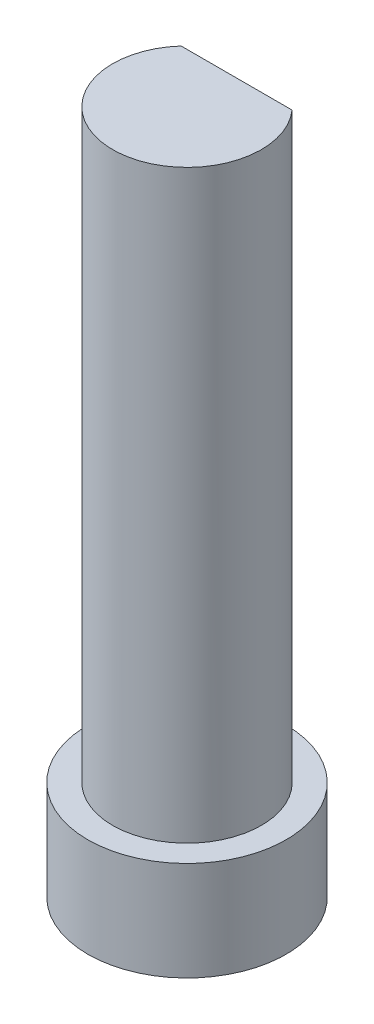
ISO-10303-21;
HEADER;
FILE_DESCRIPTION(('STEP AP214'),'2;1');
FILE_NAME('part.step','',(''),(''),'','','');
FILE_SCHEMA(('AUTOMOTIVE_DESIGN { 1 0 10303 214 1 1 1 1 }'));
ENDSEC;
DATA;
#1=APPLICATION_CONTEXT('core data for automotive mechanical design processes');
#2=APPLICATION_PROTOCOL_DEFINITION('international standard','automotive_design',2000,#1);
#3=PRODUCT_CONTEXT('',#1,'mechanical');
#4=PRODUCT('Part','Part','',(#3));
#5=PRODUCT_RELATED_PRODUCT_CATEGORY('part','',(#4));
#6=PRODUCT_DEFINITION_FORMATION('','',#4);
#7=PRODUCT_DEFINITION_CONTEXT('part definition',#1,'design');
#8=PRODUCT_DEFINITION('design','',#6,#7);
#9=PRODUCT_DEFINITION_SHAPE('','',#8);
#10=(LENGTH_UNIT() NAMED_UNIT(*) SI_UNIT(.MILLI.,.METRE.));
#11=(NAMED_UNIT(*) PLANE_ANGLE_UNIT() SI_UNIT($,.RADIAN.));
#12=(NAMED_UNIT(*) SI_UNIT($,.STERADIAN.) SOLID_ANGLE_UNIT());
#13=UNCERTAINTY_MEASURE_WITH_UNIT(LENGTH_MEASURE(1.E-05),#10,'distance_accuracy_value','');
#14=(GEOMETRIC_REPRESENTATION_CONTEXT(3) GLOBAL_UNCERTAINTY_ASSIGNED_CONTEXT((#13)) GLOBAL_UNIT_ASSIGNED_CONTEXT((#10,
#11,#12)) REPRESENTATION_CONTEXT('',''));
#15=CARTESIAN_POINT('',(0.,0.,0.));
#16=DIRECTION('',(0.,0.,1.));
#17=DIRECTION('',(1.,0.,0.));
#18=AXIS2_PLACEMENT_3D('',#15,#16,#17);
#19=CARTESIAN_POINT('',(0.,13.8,0.));
#20=DIRECTION('',(0.,-1.,0.));
#21=DIRECTION('',(0.,0.,-1.));
#22=AXIS2_PLACEMENT_3D('',#19,#20,#21);
#23=CYLINDRICAL_SURFACE('',#22,1.5);
#24=CARTESIAN_POINT('',(0.,13.8,0.));
#25=DIRECTION('',(0.,1.,0.));
#26=DIRECTION('',(0.,0.,1.));
#27=AXIS2_PLACEMENT_3D('',#24,#25,#26);
#28=CIRCLE('',#27,1.5);
#29=CARTESIAN_POINT('',(-1.1180339887499,13.8,-1.));
#30=VERTEX_POINT('',#29);
#31=CARTESIAN_POINT('',(1.1180339887499,13.8,-1.));
#32=VERTEX_POINT('',#31);
#33=EDGE_CURVE('E12',#30,#32,#28,.T.);
#34=ORIENTED_EDGE('',*,*,#33,.F.);
#35=DIRECTION('',(0.,1.,0.));
#36=VECTOR('',#35,1.);
#37=CARTESIAN_POINT('',(-1.1180339887499,4.3,-1.));
#38=LINE('',#37,#36);
#39=CARTESIAN_POINT('',(-1.1180339887499,4.3,-1.));
#40=VERTEX_POINT('',#39);
#41=EDGE_CURVE('E59',#40,#30,#38,.T.);
#42=ORIENTED_EDGE('',*,*,#41,.F.);
#43=CARTESIAN_POINT('',(0.,4.3,0.));
#44=DIRECTION('',(0.,1.,0.));
#45=DIRECTION('',(0.,0.,1.));
#46=AXIS2_PLACEMENT_3D('',#43,#44,#45);
#47=CIRCLE('',#46,1.5);
#48=CARTESIAN_POINT('',(1.1180339887499,4.3,-1.));
#49=VERTEX_POINT('',#48);
#50=EDGE_CURVE('E79',#49,#40,#47,.T.);
#51=ORIENTED_EDGE('',*,*,#50,.F.);
#52=DIRECTION('',(0.,1.,0.));
#53=VECTOR('',#52,1.);
#54=CARTESIAN_POINT('',(1.1180339887499,4.3,-1.));
#55=LINE('',#54,#53);
#56=EDGE_CURVE('E72',#49,#32,#55,.T.);
#57=ORIENTED_EDGE('',*,*,#56,.T.);
#58=EDGE_LOOP('',(#34,#42,#51,#57));
#59=FACE_BOUND('',#58,.T.);
#60=CARTESIAN_POINT('',(0.,2.,0.));
#61=DIRECTION('',(0.,1.,0.));
#62=DIRECTION('',(0.,0.,1.));
#63=AXIS2_PLACEMENT_3D('',#60,#61,#62);
#64=CIRCLE('',#63,1.5);
#65=CARTESIAN_POINT('',(0.,2.,1.5));
#66=VERTEX_POINT('',#65);
#67=EDGE_CURVE('E48',#66,#66,#64,.T.);
#68=ORIENTED_EDGE('',*,*,#67,.T.);
#69=EDGE_LOOP('',(#68));
#70=FACE_BOUND('',#69,.T.);
#71=ADVANCED_FACE('F45',(#59,#70),#23,.T.);
#72=CARTESIAN_POINT('',(0.,13.8,0.));
#73=DIRECTION('',(0.,1.,0.));
#74=DIRECTION('',(0.,0.,1.));
#75=AXIS2_PLACEMENT_3D('',#72,#73,#74);
#76=PLANE('',#75);
#77=DIRECTION('',(1.,0.,0.));
#78=VECTOR('',#77,1.);
#79=CARTESIAN_POINT('',(0.,13.8,-1.));
#80=LINE('',#79,#78);
#81=EDGE_CURVE('E69',#30,#32,#80,.T.);
#82=ORIENTED_EDGE('',*,*,#81,.F.);
#83=ORIENTED_EDGE('',*,*,#33,.T.);
#84=EDGE_LOOP('',(#82,#83));
#85=FACE_BOUND('',#84,.T.);
#86=ADVANCED_FACE('F81',(#85),#76,.T.);
#87=CARTESIAN_POINT('',(0.,2.,0.));
#88=DIRECTION('',(0.,1.,0.));
#89=DIRECTION('',(0.,0.,1.));
#90=AXIS2_PLACEMENT_3D('',#87,#88,#89);
#91=PLANE('',#90);
#92=ORIENTED_EDGE('',*,*,#67,.F.);
#93=EDGE_LOOP('',(#92));
#94=FACE_BOUND('',#93,.T.);
#95=ADVANCED_FACE('F83',(#94),#91,.F.);
#96=CARTESIAN_POINT('',(0.,4.3,-1.));
#97=DIRECTION('',(0.,0.,1.));
#98=DIRECTION('',(1.,0.,0.));
#99=AXIS2_PLACEMENT_3D('',#96,#97,#98);
#100=PLANE('',#99);
#101=ORIENTED_EDGE('',*,*,#81,.T.);
#102=ORIENTED_EDGE('',*,*,#56,.F.);
#103=DIRECTION('',(1.,0.,0.));
#104=VECTOR('',#103,1.);
#105=CARTESIAN_POINT('',(0.,4.3,-1.));
#106=LINE('',#105,#104);
#107=EDGE_CURVE('E65',#40,#49,#106,.T.);
#108=ORIENTED_EDGE('',*,*,#107,.F.);
#109=ORIENTED_EDGE('',*,*,#41,.T.);
#110=EDGE_LOOP('',(#101,#102,#108,#109));
#111=FACE_BOUND('',#110,.T.);
#112=ADVANCED_FACE('F71',(#111),#100,.F.);
#113=CARTESIAN_POINT('',(0.,4.3,0.));
#114=DIRECTION('',(0.,1.,0.));
#115=DIRECTION('',(0.,0.,1.));
#116=AXIS2_PLACEMENT_3D('',#113,#114,#115);
#117=PLANE('',#116);
#118=ORIENTED_EDGE('',*,*,#107,.T.);
#119=ORIENTED_EDGE('',*,*,#50,.T.);
#120=EDGE_LOOP('',(#118,#119));
#121=FACE_BOUND('',#120,.T.);
#122=ADVANCED_FACE('F93',(#121),#117,.T.);
#123=CLOSED_SHELL('',(#71,#86,#95,#112,#122));
#124=MANIFOLD_SOLID_BREP('B2',#123);
#125=CARTESIAN_POINT('',(0.,2.,0.));
#126=DIRECTION('',(0.,-1.,0.));
#127=DIRECTION('',(0.,0.,-1.));
#128=AXIS2_PLACEMENT_3D('',#125,#126,#127);
#129=CYLINDRICAL_SURFACE('',#128,2.);
#130=CARTESIAN_POINT('',(0.,2.,0.));
#131=DIRECTION('',(0.,1.,0.));
#132=DIRECTION('',(0.,0.,1.));
#133=AXIS2_PLACEMENT_3D('',#130,#131,#132);
#134=CIRCLE('',#133,2.);
#135=CARTESIAN_POINT('',(0.,2.,2.));
#136=VERTEX_POINT('',#135);
#137=EDGE_CURVE('E44',#136,#136,#134,.T.);
#138=ORIENTED_EDGE('',*,*,#137,.F.);
#139=EDGE_LOOP('',(#138));
#140=FACE_BOUND('',#139,.T.);
#141=CARTESIAN_POINT('',(0.,0.,0.));
#142=DIRECTION('',(0.,1.,0.));
#143=DIRECTION('',(0.,0.,1.));
#144=AXIS2_PLACEMENT_3D('',#141,#142,#143);
#145=CIRCLE('',#144,2.);
#146=CARTESIAN_POINT('',(0.,0.,2.));
#147=VERTEX_POINT('',#146);
#148=EDGE_CURVE('E138',#147,#147,#145,.T.);
#149=ORIENTED_EDGE('',*,*,#148,.T.);
#150=EDGE_LOOP('',(#149));
#151=FACE_BOUND('',#150,.T.);
#152=ADVANCED_FACE('F135',(#140,#151),#129,.T.);
#153=CARTESIAN_POINT('',(0.,2.,0.));
#154=DIRECTION('',(0.,1.,0.));
#155=DIRECTION('',(0.,0.,1.));
#156=AXIS2_PLACEMENT_3D('',#153,#154,#155);
#157=PLANE('',#156);
#158=CARTESIAN_POINT('',(0.,2.,0.));
#159=DIRECTION('',(0.,-1.,0.));
#160=DIRECTION('',(0.,0.,-1.));
#161=AXIS2_PLACEMENT_3D('',#158,#159,#160);
#162=CIRCLE('',#161,0.2);
#163=CARTESIAN_POINT('',(0.,2.,-0.2));
#164=VERTEX_POINT('',#163);
#165=EDGE_CURVE('E145',#164,#164,#162,.T.);
#166=ORIENTED_EDGE('',*,*,#165,.T.);
#167=EDGE_LOOP('',(#166));
#168=FACE_BOUND('',#167,.T.);
#169=ORIENTED_EDGE('',*,*,#137,.T.);
#170=EDGE_LOOP('',(#169));
#171=FACE_BOUND('',#170,.T.);
#172=ADVANCED_FACE('F153',(#168,#171),#157,.T.);
#173=CARTESIAN_POINT('',(0.,0.,0.));
#174=DIRECTION('',(0.,1.,0.));
#175=DIRECTION('',(0.,0.,1.));
#176=AXIS2_PLACEMENT_3D('',#173,#174,#175);
#177=PLANE('',#176);
#178=CARTESIAN_POINT('',(0.,0.,0.));
#179=DIRECTION('',(0.,-1.,0.));
#180=DIRECTION('',(0.,0.,-1.));
#181=AXIS2_PLACEMENT_3D('',#178,#179,#180);
#182=CIRCLE('',#181,0.2);
#183=CARTESIAN_POINT('',(0.,0.,-0.2));
#184=VERTEX_POINT('',#183);
#185=EDGE_CURVE('E147',#184,#184,#182,.T.);
#186=ORIENTED_EDGE('',*,*,#185,.F.);
#187=EDGE_LOOP('',(#186));
#188=FACE_BOUND('',#187,.T.);
#189=ORIENTED_EDGE('',*,*,#148,.F.);
#190=EDGE_LOOP('',(#189));
#191=FACE_BOUND('',#190,.T.);
#192=ADVANCED_FACE('F158',(#188,#191),#177,.F.);
#193=CARTESIAN_POINT('',(0.,2.,0.));
#194=DIRECTION('',(0.,-1.,0.));
#195=DIRECTION('',(0.,0.,-1.));
#196=AXIS2_PLACEMENT_3D('',#193,#194,#195);
#197=CYLINDRICAL_SURFACE('',#196,0.2);
#198=ORIENTED_EDGE('',*,*,#165,.F.);
#199=EDGE_LOOP('',(#198));
#200=FACE_BOUND('',#199,.T.);
#201=ORIENTED_EDGE('',*,*,#185,.T.);
#202=EDGE_LOOP('',(#201));
#203=FACE_BOUND('',#202,.T.);
#204=ADVANCED_FACE('F155',(#200,#203),#197,.F.);
#205=CLOSED_SHELL('',(#152,#172,#192,#204));
#206=MANIFOLD_SOLID_BREP('B6',#205);
#207=ADVANCED_BREP_SHAPE_REPRESENTATION('',(#18,#124,#206),#14);
#208=SHAPE_DEFINITION_REPRESENTATION(#9,#207);
ENDSEC;
END-ISO-10303-21;
